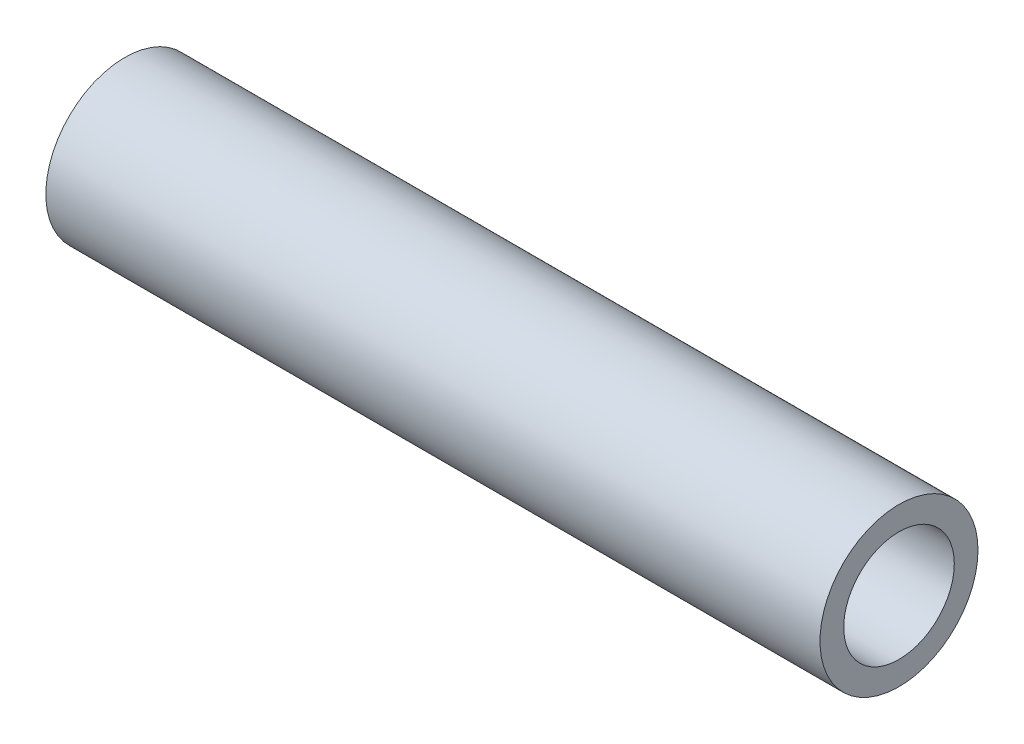
ISO-10303-21;
HEADER;
FILE_DESCRIPTION(('STEP AP214'),'2;1');
FILE_NAME('part.step','',(''),(''),'','','');
FILE_SCHEMA(('AUTOMOTIVE_DESIGN { 1 0 10303 214 1 1 1 1 }'));
ENDSEC;
DATA;
#1=APPLICATION_CONTEXT('core data for automotive mechanical design processes');
#2=APPLICATION_PROTOCOL_DEFINITION('international standard','automotive_design',2000,#1);
#3=PRODUCT_CONTEXT('',#1,'mechanical');
#4=PRODUCT('Part','Part','',(#3));
#5=PRODUCT_RELATED_PRODUCT_CATEGORY('part','',(#4));
#6=PRODUCT_DEFINITION_FORMATION('','',#4);
#7=PRODUCT_DEFINITION_CONTEXT('part definition',#1,'design');
#8=PRODUCT_DEFINITION('design','',#6,#7);
#9=PRODUCT_DEFINITION_SHAPE('','',#8);
#10=(LENGTH_UNIT() NAMED_UNIT(*) SI_UNIT(.MILLI.,.METRE.));
#11=(NAMED_UNIT(*) PLANE_ANGLE_UNIT() SI_UNIT($,.RADIAN.));
#12=(NAMED_UNIT(*) SI_UNIT($,.STERADIAN.) SOLID_ANGLE_UNIT());
#13=UNCERTAINTY_MEASURE_WITH_UNIT(LENGTH_MEASURE(1.E-05),#10,'distance_accuracy_value','');
#14=(GEOMETRIC_REPRESENTATION_CONTEXT(3) GLOBAL_UNCERTAINTY_ASSIGNED_CONTEXT((#13)) GLOBAL_UNIT_ASSIGNED_CONTEXT((#10,
#11,#12)) REPRESENTATION_CONTEXT('',''));
#15=CARTESIAN_POINT('',(0.,0.,0.));
#16=DIRECTION('',(0.,0.,1.));
#17=DIRECTION('',(1.,0.,0.));
#18=AXIS2_PLACEMENT_3D('',#15,#16,#17);
#19=CARTESIAN_POINT('',(24.5,0.,0.));
#20=DIRECTION('',(1.,0.,0.));
#21=DIRECTION('',(0.,0.,-1.));
#22=AXIS2_PLACEMENT_3D('',#19,#20,#21);
#23=PLANE('',#22);
#24=CARTESIAN_POINT('',(24.5,0.,0.));
#25=DIRECTION('',(1.,0.,0.));
#26=DIRECTION('',(0.,0.,-1.));
#27=AXIS2_PLACEMENT_3D('',#24,#25,#26);
#28=CIRCLE('',#27,5.);
#29=CARTESIAN_POINT('',(24.5,0.,-5.));
#30=VERTEX_POINT('',#29);
#31=EDGE_CURVE('E10',#30,#30,#28,.T.);
#32=ORIENTED_EDGE('',*,*,#31,.T.);
#33=EDGE_LOOP('',(#32));
#34=FACE_BOUND('',#33,.T.);
#35=CARTESIAN_POINT('',(24.5,0.,0.));
#36=DIRECTION('',(1.,0.,0.));
#37=DIRECTION('',(0.,0.,-1.));
#38=AXIS2_PLACEMENT_3D('',#35,#36,#37);
#39=CIRCLE('',#38,3.5);
#40=CARTESIAN_POINT('',(24.5,0.,-3.5));
#41=VERTEX_POINT('',#40);
#42=EDGE_CURVE('E56',#41,#41,#39,.T.);
#43=ORIENTED_EDGE('',*,*,#42,.F.);
#44=EDGE_LOOP('',(#43));
#45=FACE_BOUND('',#44,.T.);
#46=ADVANCED_FACE('F43',(#34,#45),#23,.T.);
#47=CARTESIAN_POINT('',(-24.5,0.,0.));
#48=DIRECTION('',(1.,0.,0.));
#49=DIRECTION('',(0.,0.,-1.));
#50=AXIS2_PLACEMENT_3D('',#47,#48,#49);
#51=PLANE('',#50);
#52=CARTESIAN_POINT('',(-24.5,0.,0.));
#53=DIRECTION('',(1.,0.,0.));
#54=DIRECTION('',(0.,0.,-1.));
#55=AXIS2_PLACEMENT_3D('',#52,#53,#54);
#56=CIRCLE('',#55,5.);
#57=CARTESIAN_POINT('',(-24.5,0.,-5.));
#58=VERTEX_POINT('',#57);
#59=EDGE_CURVE('E47',#58,#58,#56,.T.);
#60=ORIENTED_EDGE('',*,*,#59,.F.);
#61=EDGE_LOOP('',(#60));
#62=FACE_BOUND('',#61,.T.);
#63=CARTESIAN_POINT('',(-24.5,0.,0.));
#64=DIRECTION('',(1.,0.,0.));
#65=DIRECTION('',(0.,0.,-1.));
#66=AXIS2_PLACEMENT_3D('',#63,#64,#65);
#67=CIRCLE('',#66,3.5);
#68=CARTESIAN_POINT('',(-24.5,0.,-3.5));
#69=VERTEX_POINT('',#68);
#70=EDGE_CURVE('E58',#69,#69,#67,.T.);
#71=ORIENTED_EDGE('',*,*,#70,.T.);
#72=EDGE_LOOP('',(#71));
#73=FACE_BOUND('',#72,.T.);
#74=ADVANCED_FACE('F70',(#62,#73),#51,.F.);
#75=CARTESIAN_POINT('',(24.5,0.,0.));
#76=DIRECTION('',(-1.,0.,0.));
#77=DIRECTION('',(0.,0.,1.));
#78=AXIS2_PLACEMENT_3D('',#75,#76,#77);
#79=CYLINDRICAL_SURFACE('',#78,5.);
#80=ORIENTED_EDGE('',*,*,#31,.F.);
#81=EDGE_LOOP('',(#80));
#82=FACE_BOUND('',#81,.T.);
#83=ORIENTED_EDGE('',*,*,#59,.T.);
#84=EDGE_LOOP('',(#83));
#85=FACE_BOUND('',#84,.T.);
#86=ADVANCED_FACE('F45',(#82,#85),#79,.T.);
#87=CARTESIAN_POINT('',(24.5,0.,0.));
#88=DIRECTION('',(-1.,0.,0.));
#89=DIRECTION('',(0.,0.,1.));
#90=AXIS2_PLACEMENT_3D('',#87,#88,#89);
#91=CYLINDRICAL_SURFACE('',#90,3.5);
#92=ORIENTED_EDGE('',*,*,#42,.T.);
#93=EDGE_LOOP('',(#92));
#94=FACE_BOUND('',#93,.T.);
#95=ORIENTED_EDGE('',*,*,#70,.F.);
#96=EDGE_LOOP('',(#95));
#97=FACE_BOUND('',#96,.T.);
#98=ADVANCED_FACE('F66',(#94,#97),#91,.F.);
#99=CLOSED_SHELL('',(#46,#74,#86,#98));
#100=MANIFOLD_SOLID_BREP('B2',#99);
#101=ADVANCED_BREP_SHAPE_REPRESENTATION('',(#18,#100),#14);
#102=SHAPE_DEFINITION_REPRESENTATION(#9,#101);
ENDSEC;
END-ISO-10303-21;
